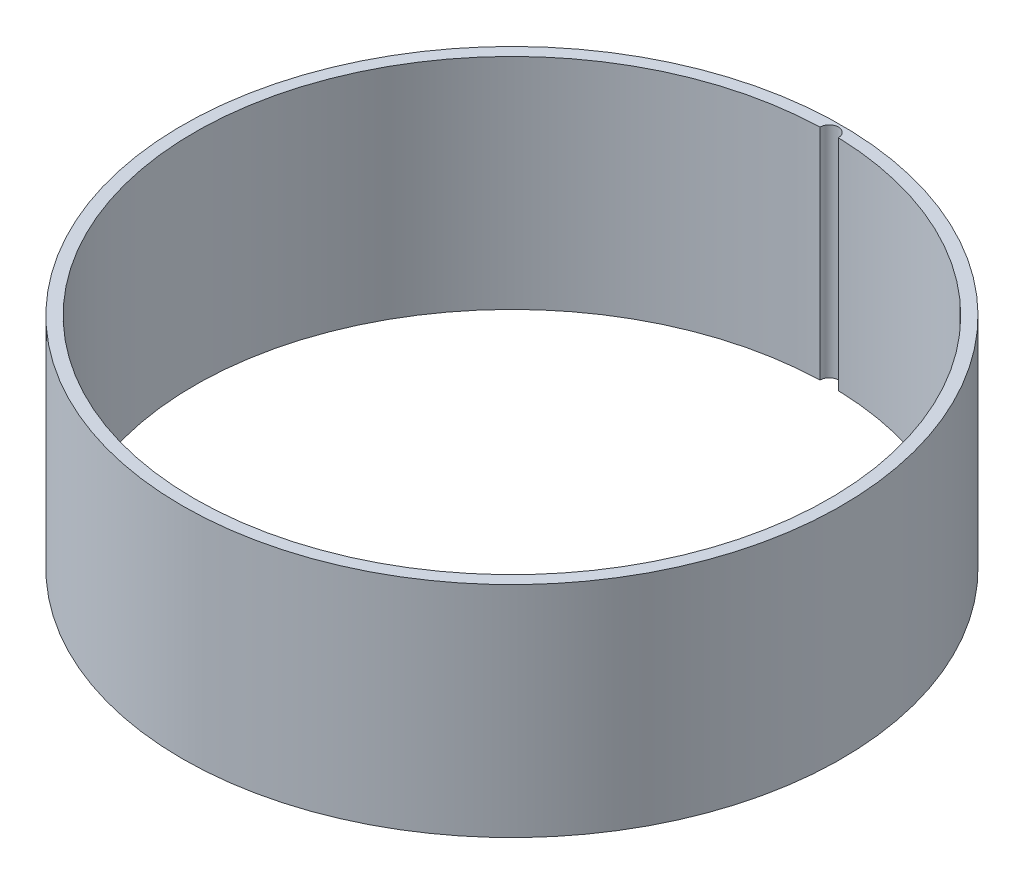
ISO-10303-21;
HEADER;
FILE_DESCRIPTION(('STEP AP214'),'2;1');
FILE_NAME('part.step','',(''),(''),'','','');
FILE_SCHEMA(('AUTOMOTIVE_DESIGN { 1 0 10303 214 1 1 1 1 }'));
ENDSEC;
DATA;
#1=APPLICATION_CONTEXT('core data for automotive mechanical design processes');
#2=APPLICATION_PROTOCOL_DEFINITION('international standard','automotive_design',2000,#1);
#3=PRODUCT_CONTEXT('',#1,'mechanical');
#4=PRODUCT('Part','Part','',(#3));
#5=PRODUCT_RELATED_PRODUCT_CATEGORY('part','',(#4));
#6=PRODUCT_DEFINITION_FORMATION('','',#4);
#7=PRODUCT_DEFINITION_CONTEXT('part definition',#1,'design');
#8=PRODUCT_DEFINITION('design','',#6,#7);
#9=PRODUCT_DEFINITION_SHAPE('','',#8);
#10=(LENGTH_UNIT() NAMED_UNIT(*) SI_UNIT(.MILLI.,.METRE.));
#11=(NAMED_UNIT(*) PLANE_ANGLE_UNIT() SI_UNIT($,.RADIAN.));
#12=(NAMED_UNIT(*) SI_UNIT($,.STERADIAN.) SOLID_ANGLE_UNIT());
#13=UNCERTAINTY_MEASURE_WITH_UNIT(LENGTH_MEASURE(1.E-05),#10,'distance_accuracy_value','');
#14=(GEOMETRIC_REPRESENTATION_CONTEXT(3) GLOBAL_UNCERTAINTY_ASSIGNED_CONTEXT((#13)) GLOBAL_UNIT_ASSIGNED_CONTEXT((#10,
#11,#12)) REPRESENTATION_CONTEXT('',''));
#15=CARTESIAN_POINT('',(0.,0.,0.));
#16=DIRECTION('',(0.,0.,1.));
#17=DIRECTION('',(1.,0.,0.));
#18=AXIS2_PLACEMENT_3D('',#15,#16,#17);
#19=CARTESIAN_POINT('',(0.,17.95,0.));
#20=DIRECTION('',(0.,1.,0.));
#21=DIRECTION('',(0.,0.,1.));
#22=AXIS2_PLACEMENT_3D('',#19,#20,#21);
#23=PLANE('',#22);
#24=CARTESIAN_POINT('',(0.,17.95,0.));
#25=DIRECTION('',(0.,1.,0.));
#26=DIRECTION('',(0.,0.,1.));
#27=AXIS2_PLACEMENT_3D('',#24,#25,#26);
#28=CIRCLE('',#27,27.);
#29=CARTESIAN_POINT('',(0.,17.95,27.));
#30=VERTEX_POINT('',#29);
#31=EDGE_CURVE('E11',#30,#30,#28,.T.);
#32=ORIENTED_EDGE('',*,*,#31,.T.);
#33=EDGE_LOOP('',(#32));
#34=FACE_BOUND('',#33,.T.);
#35=CARTESIAN_POINT('',(0.,17.95,0.));
#36=DIRECTION('',(0.,1.,0.));
#37=DIRECTION('',(0.,0.,1.));
#38=AXIS2_PLACEMENT_3D('',#35,#36,#37);
#39=CIRCLE('',#38,26.);
#40=CARTESIAN_POINT('',(-0.749921986512087,17.95,-25.9891826923077));
#41=VERTEX_POINT('',#40);
#42=CARTESIAN_POINT('',(0.749921986512093,17.95,-25.9891826923077));
#43=VERTEX_POINT('',#42);
#44=EDGE_CURVE('E75',#41,#43,#39,.T.);
#45=ORIENTED_EDGE('',*,*,#44,.F.);
#46=CARTESIAN_POINT('',(0.,17.95,-26.));
#47=DIRECTION('',(0.,1.,0.));
#48=DIRECTION('',(0.,0.,1.));
#49=AXIS2_PLACEMENT_3D('',#46,#47,#48);
#50=CIRCLE('',#49,0.749999999999974);
#51=EDGE_CURVE('E66',#43,#41,#50,.T.);
#52=ORIENTED_EDGE('',*,*,#51,.F.);
#53=EDGE_LOOP('',(#45,#52));
#54=FACE_BOUND('',#53,.T.);
#55=ADVANCED_FACE('F34',(#34,#54),#23,.T.);
#56=CARTESIAN_POINT('',(0.,0.,0.));
#57=DIRECTION('',(0.,1.,0.));
#58=DIRECTION('',(0.,0.,1.));
#59=AXIS2_PLACEMENT_3D('',#56,#57,#58);
#60=PLANE('',#59);
#61=CARTESIAN_POINT('',(0.,0.,0.));
#62=DIRECTION('',(0.,1.,0.));
#63=DIRECTION('',(0.,0.,1.));
#64=AXIS2_PLACEMENT_3D('',#61,#62,#63);
#65=CIRCLE('',#64,27.);
#66=CARTESIAN_POINT('',(0.,0.,27.));
#67=VERTEX_POINT('',#66);
#68=EDGE_CURVE('E38',#67,#67,#65,.T.);
#69=ORIENTED_EDGE('',*,*,#68,.F.);
#70=EDGE_LOOP('',(#69));
#71=FACE_BOUND('',#70,.T.);
#72=CARTESIAN_POINT('',(0.,0.,-26.));
#73=DIRECTION('',(0.,1.,0.));
#74=DIRECTION('',(0.,0.,1.));
#75=AXIS2_PLACEMENT_3D('',#72,#73,#74);
#76=CIRCLE('',#75,0.749999999999974);
#77=CARTESIAN_POINT('',(0.749921986512093,0.,-25.9891826923077));
#78=VERTEX_POINT('',#77);
#79=CARTESIAN_POINT('',(-0.749921986512087,0.,-25.9891826923077));
#80=VERTEX_POINT('',#79);
#81=EDGE_CURVE('E56',#78,#80,#76,.T.);
#82=ORIENTED_EDGE('',*,*,#81,.T.);
#83=CARTESIAN_POINT('',(0.,0.,0.));
#84=DIRECTION('',(0.,1.,0.));
#85=DIRECTION('',(0.,0.,1.));
#86=AXIS2_PLACEMENT_3D('',#83,#84,#85);
#87=CIRCLE('',#86,26.);
#88=EDGE_CURVE('E62',#80,#78,#87,.T.);
#89=ORIENTED_EDGE('',*,*,#88,.T.);
#90=EDGE_LOOP('',(#82,#89));
#91=FACE_BOUND('',#90,.T.);
#92=ADVANCED_FACE('F72',(#71,#91),#60,.F.);
#93=CARTESIAN_POINT('',(0.,17.95,0.));
#94=DIRECTION('',(0.,-1.,0.));
#95=DIRECTION('',(0.,0.,-1.));
#96=AXIS2_PLACEMENT_3D('',#93,#94,#95);
#97=CYLINDRICAL_SURFACE('',#96,27.);
#98=ORIENTED_EDGE('',*,*,#31,.F.);
#99=EDGE_LOOP('',(#98));
#100=FACE_BOUND('',#99,.T.);
#101=ORIENTED_EDGE('',*,*,#68,.T.);
#102=EDGE_LOOP('',(#101));
#103=FACE_BOUND('',#102,.T.);
#104=ADVANCED_FACE('F36',(#100,#103),#97,.T.);
#105=CARTESIAN_POINT('',(0.,17.95,-26.));
#106=DIRECTION('',(0.,-1.,0.));
#107=DIRECTION('',(0.,0.,-1.));
#108=AXIS2_PLACEMENT_3D('',#105,#106,#107);
#109=CYLINDRICAL_SURFACE('',#108,0.749999999999974);
#110=ORIENTED_EDGE('',*,*,#81,.F.);
#111=DIRECTION('',(0.,-1.,0.));
#112=VECTOR('',#111,1.);
#113=CARTESIAN_POINT('',(0.749921986512093,17.95,-25.9891826923077));
#114=LINE('',#113,#112);
#115=EDGE_CURVE('E64',#43,#78,#114,.T.);
#116=ORIENTED_EDGE('',*,*,#115,.F.);
#117=ORIENTED_EDGE('',*,*,#51,.T.);
#118=DIRECTION('',(0.,-1.,0.));
#119=VECTOR('',#118,1.);
#120=CARTESIAN_POINT('',(-0.749921986512087,17.95,-25.9891826923077));
#121=LINE('',#120,#119);
#122=EDGE_CURVE('E49',#41,#80,#121,.T.);
#123=ORIENTED_EDGE('',*,*,#122,.T.);
#124=EDGE_LOOP('',(#110,#116,#117,#123));
#125=FACE_BOUND('',#124,.T.);
#126=ADVANCED_FACE('F68',(#125),#109,.F.);
#127=CARTESIAN_POINT('',(0.,17.95,0.));
#128=DIRECTION('',(0.,-1.,0.));
#129=DIRECTION('',(0.,0.,-1.));
#130=AXIS2_PLACEMENT_3D('',#127,#128,#129);
#131=CYLINDRICAL_SURFACE('',#130,26.);
#132=ORIENTED_EDGE('',*,*,#88,.F.);
#133=ORIENTED_EDGE('',*,*,#122,.F.);
#134=ORIENTED_EDGE('',*,*,#44,.T.);
#135=ORIENTED_EDGE('',*,*,#115,.T.);
#136=EDGE_LOOP('',(#132,#133,#134,#135));
#137=FACE_BOUND('',#136,.T.);
#138=ADVANCED_FACE('F63',(#137),#131,.F.);
#139=CLOSED_SHELL('',(#55,#92,#104,#126,#138));
#140=MANIFOLD_SOLID_BREP('B2',#139);
#141=ADVANCED_BREP_SHAPE_REPRESENTATION('',(#18,#140),#14);
#142=SHAPE_DEFINITION_REPRESENTATION(#9,#141);
ENDSEC;
END-ISO-10303-21;
